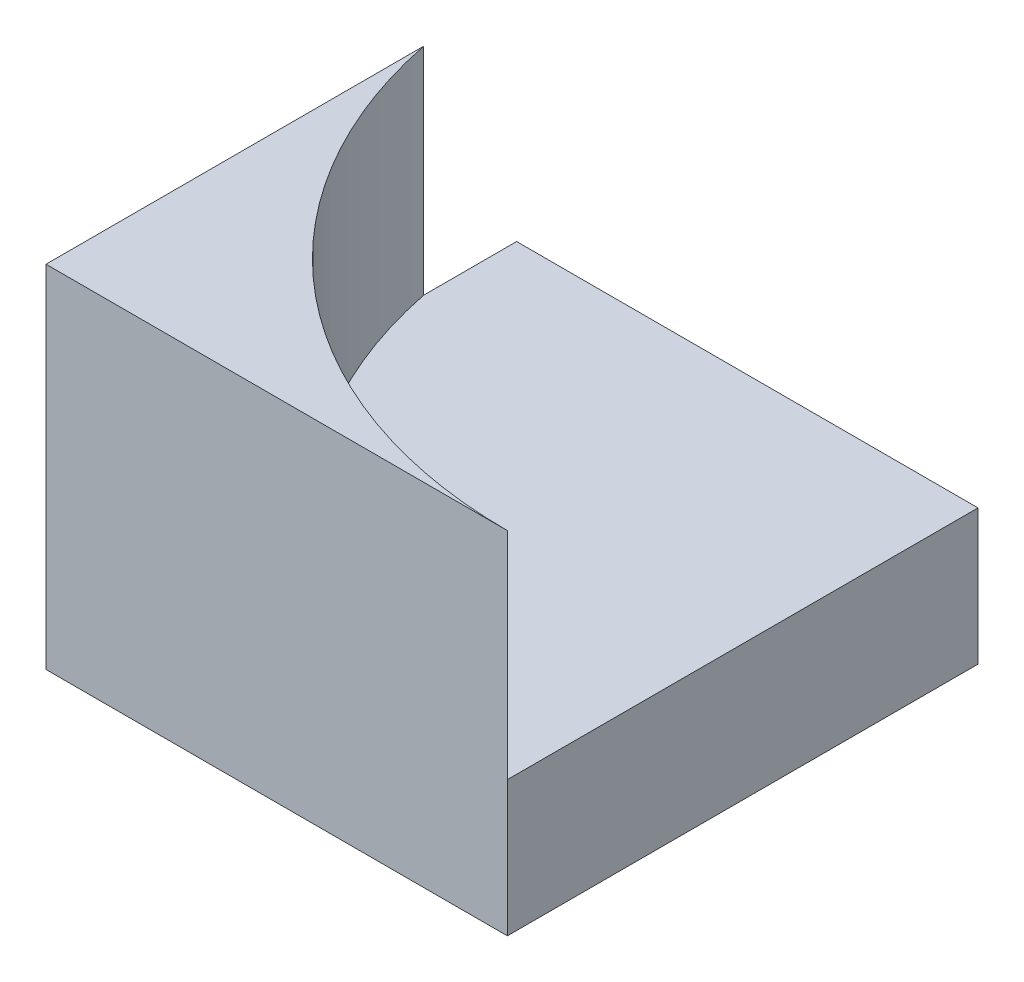
ISO-10303-21;
HEADER;
FILE_DESCRIPTION(('STEP AP214'),'2;1');
FILE_NAME('part.step','',(''),(''),'','','');
FILE_SCHEMA(('AUTOMOTIVE_DESIGN { 1 0 10303 214 1 1 1 1 }'));
ENDSEC;
DATA;
#1=APPLICATION_CONTEXT('core data for automotive mechanical design processes');
#2=APPLICATION_PROTOCOL_DEFINITION('international standard','automotive_design',2000,#1);
#3=PRODUCT_CONTEXT('',#1,'mechanical');
#4=PRODUCT('Part','Part','',(#3));
#5=PRODUCT_RELATED_PRODUCT_CATEGORY('part','',(#4));
#6=PRODUCT_DEFINITION_FORMATION('','',#4);
#7=PRODUCT_DEFINITION_CONTEXT('part definition',#1,'design');
#8=PRODUCT_DEFINITION('design','',#6,#7);
#9=PRODUCT_DEFINITION_SHAPE('','',#8);
#10=(LENGTH_UNIT() NAMED_UNIT(*) SI_UNIT(.MILLI.,.METRE.));
#11=(NAMED_UNIT(*) PLANE_ANGLE_UNIT() SI_UNIT($,.RADIAN.));
#12=(NAMED_UNIT(*) SI_UNIT($,.STERADIAN.) SOLID_ANGLE_UNIT());
#13=UNCERTAINTY_MEASURE_WITH_UNIT(LENGTH_MEASURE(1.E-05),#10,'distance_accuracy_value','');
#14=(GEOMETRIC_REPRESENTATION_CONTEXT(3) GLOBAL_UNCERTAINTY_ASSIGNED_CONTEXT((#13)) GLOBAL_UNIT_ASSIGNED_CONTEXT((#10,
#11,#12)) REPRESENTATION_CONTEXT('',''));
#15=CARTESIAN_POINT('',(0.,0.,0.));
#16=DIRECTION('',(0.,0.,1.));
#17=DIRECTION('',(1.,0.,0.));
#18=AXIS2_PLACEMENT_3D('',#15,#16,#17);
#19=CARTESIAN_POINT('',(97.,0.,0.));
#20=DIRECTION('',(0.,-1.,0.));
#21=DIRECTION('',(0.,0.,-1.));
#22=AXIS2_PLACEMENT_3D('',#19,#20,#21);
#23=PLANE('',#22);
#24=DIRECTION('',(-1.,0.,0.));
#25=VECTOR('',#24,1.);
#26=CARTESIAN_POINT('',(97.,0.,0.));
#27=LINE('',#26,#25);
#28=CARTESIAN_POINT('',(97.,0.,0.));
#29=VERTEX_POINT('',#28);
#30=CARTESIAN_POINT('',(0.,0.,0.));
#31=VERTEX_POINT('',#30);
#32=EDGE_CURVE('E117',#29,#31,#27,.T.);
#33=ORIENTED_EDGE('',*,*,#32,.F.);
#34=CARTESIAN_POINT('',(97.,0.,-98.9468589389162));
#35=DIRECTION('',(0.,1.,0.));
#36=DIRECTION('',(0.,0.,1.));
#37=AXIS2_PLACEMENT_3D('',#34,#35,#36);
#38=CIRCLE('',#37,98.9468589389162);
#39=CARTESIAN_POINT('',(0.,0.,-79.4153230577374));
#40=VERTEX_POINT('',#39);
#41=EDGE_CURVE('E137',#40,#29,#38,.T.);
#42=ORIENTED_EDGE('',*,*,#41,.F.);
#43=DIRECTION('',(0.,0.,1.));
#44=VECTOR('',#43,1.);
#45=CARTESIAN_POINT('',(0.,0.,0.));
#46=LINE('',#45,#44);
#47=EDGE_CURVE('E140',#40,#31,#46,.T.);
#48=ORIENTED_EDGE('',*,*,#47,.T.);
#49=EDGE_LOOP('',(#33,#42,#48));
#50=FACE_BOUND('',#49,.T.);
#51=ADVANCED_FACE('F45',(#50),#23,.F.);
#52=CARTESIAN_POINT('',(97.,0.,0.));
#53=DIRECTION('',(0.,0.,-1.));
#54=DIRECTION('',(-1.,0.,0.));
#55=AXIS2_PLACEMENT_3D('',#52,#53,#54);
#56=PLANE('',#55);
#57=DIRECTION('',(0.,-1.,0.));
#58=VECTOR('',#57,1.);
#59=CARTESIAN_POINT('',(0.,0.,0.));
#60=LINE('',#59,#58);
#61=CARTESIAN_POINT('',(0.,-73.7960675436398,0.));
#62=VERTEX_POINT('',#61);
#63=EDGE_CURVE('E97',#31,#62,#60,.T.);
#64=ORIENTED_EDGE('',*,*,#63,.T.);
#65=DIRECTION('',(-1.,0.,0.));
#66=VECTOR('',#65,1.);
#67=CARTESIAN_POINT('',(97.,-73.7960675436398,0.));
#68=LINE('',#67,#66);
#69=CARTESIAN_POINT('',(97.,-73.7960675436398,0.));
#70=VERTEX_POINT('',#69);
#71=EDGE_CURVE('E91',#70,#62,#68,.T.);
#72=ORIENTED_EDGE('',*,*,#71,.F.);
#73=DIRECTION('',(0.,-1.,0.));
#74=VECTOR('',#73,1.);
#75=CARTESIAN_POINT('',(97.,0.,0.));
#76=LINE('',#75,#74);
#77=CARTESIAN_POINT('',(97.,-45.3441409440529,0.));
#78=VERTEX_POINT('',#77);
#79=EDGE_CURVE('E108',#78,#70,#76,.T.);
#80=ORIENTED_EDGE('',*,*,#79,.F.);
#81=EDGE_CURVE('E111',#29,#78,#76,.T.);
#82=ORIENTED_EDGE('',*,*,#81,.F.);
#83=ORIENTED_EDGE('',*,*,#32,.T.);
#84=EDGE_LOOP('',(#64,#72,#80,#82,#83));
#85=FACE_BOUND('',#84,.T.);
#86=ADVANCED_FACE('F162',(#85),#56,.F.);
#87=CARTESIAN_POINT('',(97.,-73.7960675436398,0.));
#88=DIRECTION('',(0.,1.,0.));
#89=DIRECTION('',(0.,0.,1.));
#90=AXIS2_PLACEMENT_3D('',#87,#88,#89);
#91=PLANE('',#90);
#92=DIRECTION('',(0.,0.,-1.));
#93=VECTOR('',#92,1.);
#94=CARTESIAN_POINT('',(0.,-73.7960675436398,0.));
#95=LINE('',#94,#93);
#96=CARTESIAN_POINT('',(0.,-73.7960675436398,-98.9468589389162));
#97=VERTEX_POINT('',#96);
#98=EDGE_CURVE('E85',#62,#97,#95,.T.);
#99=ORIENTED_EDGE('',*,*,#98,.T.);
#100=DIRECTION('',(-1.,0.,0.));
#101=VECTOR('',#100,1.);
#102=CARTESIAN_POINT('',(97.,-73.7960675436398,-98.9468589389162));
#103=LINE('',#102,#101);
#104=CARTESIAN_POINT('',(97.,-73.7960675436398,-98.9468589389162));
#105=VERTEX_POINT('',#104);
#106=EDGE_CURVE('E88',#105,#97,#103,.T.);
#107=ORIENTED_EDGE('',*,*,#106,.F.);
#108=DIRECTION('',(0.,0.,-1.));
#109=VECTOR('',#108,1.);
#110=CARTESIAN_POINT('',(97.,-73.7960675436398,0.));
#111=LINE('',#110,#109);
#112=EDGE_CURVE('E69',#70,#105,#111,.T.);
#113=ORIENTED_EDGE('',*,*,#112,.F.);
#114=ORIENTED_EDGE('',*,*,#71,.T.);
#115=EDGE_LOOP('',(#99,#107,#113,#114));
#116=FACE_BOUND('',#115,.T.);
#117=ADVANCED_FACE('F87',(#116),#91,.F.);
#118=CARTESIAN_POINT('',(97.,0.,-98.9468589389162));
#119=DIRECTION('',(0.,0.,1.));
#120=DIRECTION('',(1.,0.,0.));
#121=AXIS2_PLACEMENT_3D('',#118,#119,#120);
#122=PLANE('',#121);
#123=DIRECTION('',(0.,1.,0.));
#124=VECTOR('',#123,1.);
#125=CARTESIAN_POINT('',(0.,0.,-98.9468589389162));
#126=LINE('',#125,#124);
#127=CARTESIAN_POINT('',(0.,-45.3441409440529,-98.9468589389162));
#128=VERTEX_POINT('',#127);
#129=EDGE_CURVE('E96',#97,#128,#126,.T.);
#130=ORIENTED_EDGE('',*,*,#129,.T.);
#131=DIRECTION('',(1.,0.,0.));
#132=VECTOR('',#131,1.);
#133=CARTESIAN_POINT('',(97.,-45.3441409440529,-98.9468589389162));
#134=LINE('',#133,#132);
#135=CARTESIAN_POINT('',(97.,-45.3441409440529,-98.9468589389162));
#136=VERTEX_POINT('',#135);
#137=EDGE_CURVE('E60',#128,#136,#134,.T.);
#138=ORIENTED_EDGE('',*,*,#137,.T.);
#139=DIRECTION('',(0.,1.,0.));
#140=VECTOR('',#139,1.);
#141=CARTESIAN_POINT('',(97.,0.,-98.9468589389162));
#142=LINE('',#141,#140);
#143=EDGE_CURVE('E102',#105,#136,#142,.T.);
#144=ORIENTED_EDGE('',*,*,#143,.F.);
#145=ORIENTED_EDGE('',*,*,#106,.T.);
#146=EDGE_LOOP('',(#130,#138,#144,#145));
#147=FACE_BOUND('',#146,.T.);
#148=ADVANCED_FACE('F101',(#147),#122,.F.);
#149=CARTESIAN_POINT('',(97.,0.,0.));
#150=DIRECTION('',(-1.,0.,0.));
#151=DIRECTION('',(0.,0.,1.));
#152=AXIS2_PLACEMENT_3D('',#149,#150,#151);
#153=PLANE('',#152);
#154=ORIENTED_EDGE('',*,*,#143,.T.);
#155=DIRECTION('',(0.,0.,1.));
#156=VECTOR('',#155,1.);
#157=CARTESIAN_POINT('',(97.,-45.3441409440529,0.));
#158=LINE('',#157,#156);
#159=EDGE_CURVE('E145',#136,#78,#158,.T.);
#160=ORIENTED_EDGE('',*,*,#159,.T.);
#161=ORIENTED_EDGE('',*,*,#79,.T.);
#162=ORIENTED_EDGE('',*,*,#112,.T.);
#163=EDGE_LOOP('',(#154,#160,#161,#162));
#164=FACE_BOUND('',#163,.T.);
#165=ADVANCED_FACE('F174',(#164),#153,.F.);
#166=CARTESIAN_POINT('',(0.,0.,0.));
#167=DIRECTION('',(-1.,0.,0.));
#168=DIRECTION('',(0.,0.,1.));
#169=AXIS2_PLACEMENT_3D('',#166,#167,#168);
#170=PLANE('',#169);
#171=DIRECTION('',(0.,1.,0.));
#172=VECTOR('',#171,1.);
#173=CARTESIAN_POINT('',(0.,0.,-79.4153230577374));
#174=LINE('',#173,#172);
#175=CARTESIAN_POINT('',(0.,-45.3441409440529,-79.4153230577374));
#176=VERTEX_POINT('',#175);
#177=EDGE_CURVE('E11',#176,#40,#174,.T.);
#178=ORIENTED_EDGE('',*,*,#177,.F.);
#179=DIRECTION('',(0.,0.,1.));
#180=VECTOR('',#179,1.);
#181=CARTESIAN_POINT('',(0.,-45.3441409440529,0.));
#182=LINE('',#181,#180);
#183=EDGE_CURVE('E53',#128,#176,#182,.T.);
#184=ORIENTED_EDGE('',*,*,#183,.F.);
#185=ORIENTED_EDGE('',*,*,#129,.F.);
#186=ORIENTED_EDGE('',*,*,#98,.F.);
#187=ORIENTED_EDGE('',*,*,#63,.F.);
#188=ORIENTED_EDGE('',*,*,#47,.F.);
#189=EDGE_LOOP('',(#178,#184,#185,#186,#187,#188));
#190=FACE_BOUND('',#189,.T.);
#191=ADVANCED_FACE('F106',(#190),#170,.T.);
#192=CARTESIAN_POINT('',(97.,0.,-98.9468589389162));
#193=DIRECTION('',(0.,1.,0.));
#194=DIRECTION('',(0.,0.,1.));
#195=AXIS2_PLACEMENT_3D('',#192,#193,#194);
#196=CYLINDRICAL_SURFACE('',#195,98.9468589389162);
#197=CARTESIAN_POINT('',(97.,-45.3441409440529,-98.9468589389162));
#198=DIRECTION('',(0.,1.,0.));
#199=DIRECTION('',(0.,0.,1.));
#200=AXIS2_PLACEMENT_3D('',#197,#198,#199);
#201=CIRCLE('',#200,98.9468589389162);
#202=EDGE_CURVE('E126',#176,#78,#201,.T.);
#203=ORIENTED_EDGE('',*,*,#202,.F.);
#204=ORIENTED_EDGE('',*,*,#177,.T.);
#205=ORIENTED_EDGE('',*,*,#41,.T.);
#206=ORIENTED_EDGE('',*,*,#81,.T.);
#207=EDGE_LOOP('',(#203,#204,#205,#206));
#208=FACE_BOUND('',#207,.T.);
#209=ADVANCED_FACE('F132',(#208),#196,.F.);
#210=CARTESIAN_POINT('',(97.,-45.3441409440529,0.));
#211=DIRECTION('',(0.,-1.,0.));
#212=DIRECTION('',(0.,0.,-1.));
#213=AXIS2_PLACEMENT_3D('',#210,#211,#212);
#214=PLANE('',#213);
#215=ORIENTED_EDGE('',*,*,#137,.F.);
#216=ORIENTED_EDGE('',*,*,#183,.T.);
#217=ORIENTED_EDGE('',*,*,#202,.T.);
#218=ORIENTED_EDGE('',*,*,#159,.F.);
#219=EDGE_LOOP('',(#215,#216,#217,#218));
#220=FACE_BOUND('',#219,.T.);
#221=ADVANCED_FACE('F124',(#220),#214,.F.);
#222=CLOSED_SHELL('',(#51,#86,#117,#148,#165,#191,#209,#221));
#223=MANIFOLD_SOLID_BREP('B2',#222);
#224=ADVANCED_BREP_SHAPE_REPRESENTATION('',(#18,#223),#14);
#225=SHAPE_DEFINITION_REPRESENTATION(#9,#224);
ENDSEC;
END-ISO-10303-21;
